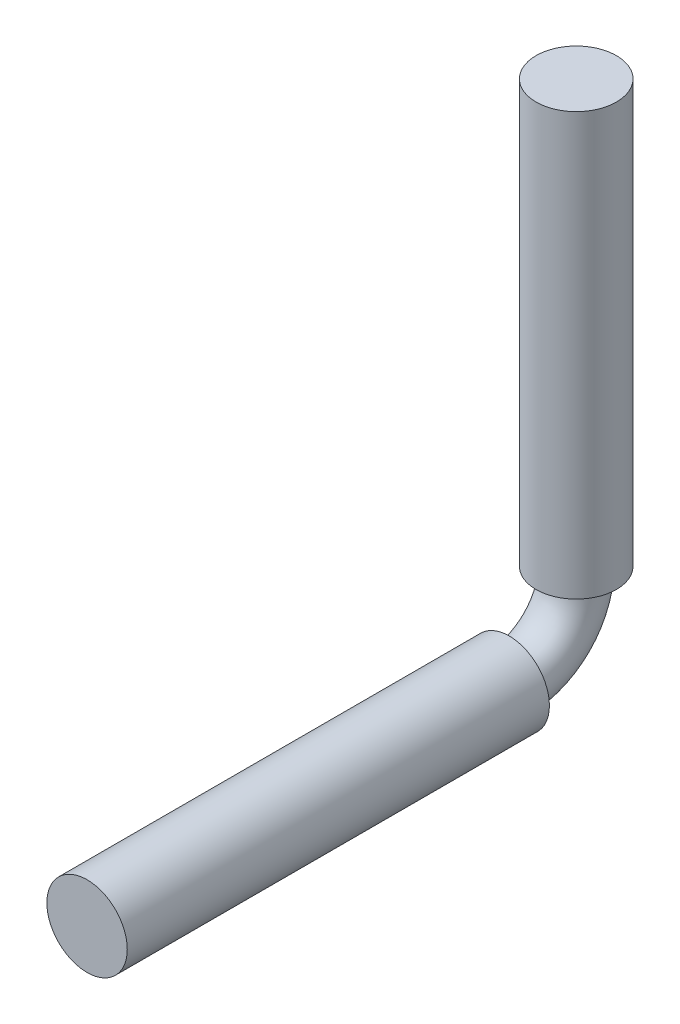
ISO-10303-21;
HEADER;
FILE_DESCRIPTION(('STEP AP214'),'2;1');
FILE_NAME('part.step','',(''),(''),'','','');
FILE_SCHEMA(('AUTOMOTIVE_DESIGN { 1 0 10303 214 1 1 1 1 }'));
ENDSEC;
DATA;
#1=APPLICATION_CONTEXT('core data for automotive mechanical design processes');
#2=APPLICATION_PROTOCOL_DEFINITION('international standard','automotive_design',2000,#1);
#3=PRODUCT_CONTEXT('',#1,'mechanical');
#4=PRODUCT('Part','Part','',(#3));
#5=PRODUCT_RELATED_PRODUCT_CATEGORY('part','',(#4));
#6=PRODUCT_DEFINITION_FORMATION('','',#4);
#7=PRODUCT_DEFINITION_CONTEXT('part definition',#1,'design');
#8=PRODUCT_DEFINITION('design','',#6,#7);
#9=PRODUCT_DEFINITION_SHAPE('','',#8);
#10=(LENGTH_UNIT() NAMED_UNIT(*) SI_UNIT(.MILLI.,.METRE.));
#11=(NAMED_UNIT(*) PLANE_ANGLE_UNIT() SI_UNIT($,.RADIAN.));
#12=(NAMED_UNIT(*) SI_UNIT($,.STERADIAN.) SOLID_ANGLE_UNIT());
#13=UNCERTAINTY_MEASURE_WITH_UNIT(LENGTH_MEASURE(1.E-05),#10,'distance_accuracy_value','');
#14=(GEOMETRIC_REPRESENTATION_CONTEXT(3) GLOBAL_UNCERTAINTY_ASSIGNED_CONTEXT((#13)) GLOBAL_UNIT_ASSIGNED_CONTEXT((#10,
#11,#12)) REPRESENTATION_CONTEXT('',''));
#15=CARTESIAN_POINT('',(0.,0.,0.));
#16=DIRECTION('',(0.,0.,1.));
#17=DIRECTION('',(1.,0.,0.));
#18=AXIS2_PLACEMENT_3D('',#15,#16,#17);
#19=CARTESIAN_POINT('',(0.,0.,31.5));
#20=DIRECTION('',(0.,0.,-1.));
#21=DIRECTION('',(-1.,0.,0.));
#22=AXIS2_PLACEMENT_3D('',#19,#20,#21);
#23=CYLINDRICAL_SURFACE('',#22,3.);
#24=CARTESIAN_POINT('',(0.,0.,31.5));
#25=DIRECTION('',(0.,0.,1.));
#26=DIRECTION('',(1.,0.,0.));
#27=AXIS2_PLACEMENT_3D('',#24,#25,#26);
#28=CIRCLE('',#27,3.);
#29=CARTESIAN_POINT('',(3.,0.,31.5));
#30=VERTEX_POINT('',#29);
#31=EDGE_CURVE('E51',#30,#30,#28,.T.);
#32=ORIENTED_EDGE('',*,*,#31,.F.);
#33=EDGE_LOOP('',(#32));
#34=FACE_BOUND('',#33,.T.);
#35=CARTESIAN_POINT('',(0.,0.,0.));
#36=DIRECTION('',(0.,0.,1.));
#37=DIRECTION('',(1.,0.,0.));
#38=AXIS2_PLACEMENT_3D('',#35,#36,#37);
#39=CIRCLE('',#38,3.);
#40=CARTESIAN_POINT('',(3.,0.,0.));
#41=VERTEX_POINT('',#40);
#42=EDGE_CURVE('E46',#41,#41,#39,.T.);
#43=ORIENTED_EDGE('',*,*,#42,.T.);
#44=EDGE_LOOP('',(#43));
#45=FACE_BOUND('',#44,.T.);
#46=ADVANCED_FACE('F43',(#34,#45),#23,.T.);
#47=CARTESIAN_POINT('',(0.,0.,31.5));
#48=DIRECTION('',(0.,0.,1.));
#49=DIRECTION('',(1.,0.,0.));
#50=AXIS2_PLACEMENT_3D('',#47,#48,#49);
#51=PLANE('',#50);
#52=ORIENTED_EDGE('',*,*,#31,.T.);
#53=EDGE_LOOP('',(#52));
#54=FACE_BOUND('',#53,.T.);
#55=ADVANCED_FACE('F89',(#54),#51,.T.);
#56=CARTESIAN_POINT('',(0.,0.,0.));
#57=DIRECTION('',(0.,0.,1.));
#58=DIRECTION('',(1.,0.,0.));
#59=AXIS2_PLACEMENT_3D('',#56,#57,#58);
#60=PLANE('',#59);
#61=CARTESIAN_POINT('',(0.,0.,0.));
#62=DIRECTION('',(0.,0.,-1.));
#63=DIRECTION('',(-1.,0.,0.));
#64=AXIS2_PLACEMENT_3D('',#61,#62,#63);
#65=CIRCLE('',#64,2.);
#66=CARTESIAN_POINT('',(0.,-2.,0.));
#67=VERTEX_POINT('',#66);
#68=EDGE_CURVE('E10',#67,#67,#65,.T.);
#69=ORIENTED_EDGE('',*,*,#68,.F.);
#70=EDGE_LOOP('',(#69));
#71=FACE_BOUND('',#70,.T.);
#72=ORIENTED_EDGE('',*,*,#42,.F.);
#73=EDGE_LOOP('',(#72));
#74=FACE_BOUND('',#73,.T.);
#75=ADVANCED_FACE('F94',(#71,#74),#60,.F.);
#76=CARTESIAN_POINT('',(0.,5.,0.));
#77=DIRECTION('',(1.,0.,0.));
#78=DIRECTION('',(0.,0.,-1.));
#79=AXIS2_PLACEMENT_3D('',#76,#77,#78);
#80=TOROIDAL_SURFACE('',#79,5.,2.);
#81=CARTESIAN_POINT('',(0.,5.,-5.));
#82=DIRECTION('',(0.,1.,0.));
#83=DIRECTION('',(-1.,0.,0.));
#84=AXIS2_PLACEMENT_3D('',#81,#82,#83);
#85=CIRCLE('',#84,2.);
#86=CARTESIAN_POINT('',(0.,5.,-7.));
#87=VERTEX_POINT('',#86);
#88=EDGE_CURVE('E61',#87,#87,#85,.T.);
#89=CARTESIAN_POINT('',(0.,5.,0.));
#90=DIRECTION('',(1.,0.,0.));
#91=DIRECTION('',(0.,0.,-1.));
#92=AXIS2_PLACEMENT_3D('',#89,#90,#91);
#93=CIRCLE('',#92,7.);
#94=EDGE_CURVE('',#67,#87,#93,.T.);
#95=ORIENTED_EDGE('',*,*,#68,.T.);
#96=ORIENTED_EDGE('',*,*,#88,.F.);
#97=ORIENTED_EDGE('',*,*,#94,.T.);
#98=ORIENTED_EDGE('',*,*,#94,.F.);
#99=EDGE_LOOP('',(#95,#97,#96,#98));
#100=FACE_BOUND('',#99,.T.);
#101=ADVANCED_FACE('F102',(#100),#80,.T.);
#102=CARTESIAN_POINT('',(0.,36.5,-4.99999999999999));
#103=DIRECTION('',(0.,-1.,0.));
#104=DIRECTION('',(0.,0.,-1.));
#105=AXIS2_PLACEMENT_3D('',#102,#103,#104);
#106=CYLINDRICAL_SURFACE('',#105,3.);
#107=CARTESIAN_POINT('',(0.,36.5,-4.99999999999999));
#108=DIRECTION('',(0.,1.,0.));
#109=DIRECTION('',(0.,0.,1.));
#110=AXIS2_PLACEMENT_3D('',#107,#108,#109);
#111=CIRCLE('',#110,3.);
#112=CARTESIAN_POINT('',(0.,36.5,-1.99999999999999));
#113=VERTEX_POINT('',#112);
#114=EDGE_CURVE('E64',#113,#113,#111,.T.);
#115=ORIENTED_EDGE('',*,*,#114,.F.);
#116=EDGE_LOOP('',(#115));
#117=FACE_BOUND('',#116,.T.);
#118=CARTESIAN_POINT('',(0.,5.,-5.));
#119=DIRECTION('',(0.,1.,0.));
#120=DIRECTION('',(0.,0.,1.));
#121=AXIS2_PLACEMENT_3D('',#118,#119,#120);
#122=CIRCLE('',#121,3.);
#123=CARTESIAN_POINT('',(0.,5.,-2.));
#124=VERTEX_POINT('',#123);
#125=EDGE_CURVE('E59',#124,#124,#122,.T.);
#126=ORIENTED_EDGE('',*,*,#125,.T.);
#127=EDGE_LOOP('',(#126));
#128=FACE_BOUND('',#127,.T.);
#129=ADVANCED_FACE('F77',(#117,#128),#106,.T.);
#130=CARTESIAN_POINT('',(0.,36.5,-4.99999999999999));
#131=DIRECTION('',(0.,1.,0.));
#132=DIRECTION('',(0.,0.,1.));
#133=AXIS2_PLACEMENT_3D('',#130,#131,#132);
#134=PLANE('',#133);
#135=ORIENTED_EDGE('',*,*,#114,.T.);
#136=EDGE_LOOP('',(#135));
#137=FACE_BOUND('',#136,.T.);
#138=ADVANCED_FACE('F81',(#137),#134,.T.);
#139=CARTESIAN_POINT('',(0.,5.,-5.));
#140=DIRECTION('',(0.,1.,0.));
#141=DIRECTION('',(0.,0.,1.));
#142=AXIS2_PLACEMENT_3D('',#139,#140,#141);
#143=PLANE('',#142);
#144=ORIENTED_EDGE('',*,*,#88,.T.);
#145=EDGE_LOOP('',(#144));
#146=FACE_BOUND('',#145,.T.);
#147=ORIENTED_EDGE('',*,*,#125,.F.);
#148=EDGE_LOOP('',(#147));
#149=FACE_BOUND('',#148,.T.);
#150=ADVANCED_FACE('F79',(#146,#149),#143,.F.);
#151=CLOSED_SHELL('',(#46,#55,#75,#101,#129,#138,#150));
#152=MANIFOLD_SOLID_BREP('B2',#151);
#153=ADVANCED_BREP_SHAPE_REPRESENTATION('',(#18,#152),#14);
#154=SHAPE_DEFINITION_REPRESENTATION(#9,#153);
ENDSEC;
END-ISO-10303-21;
